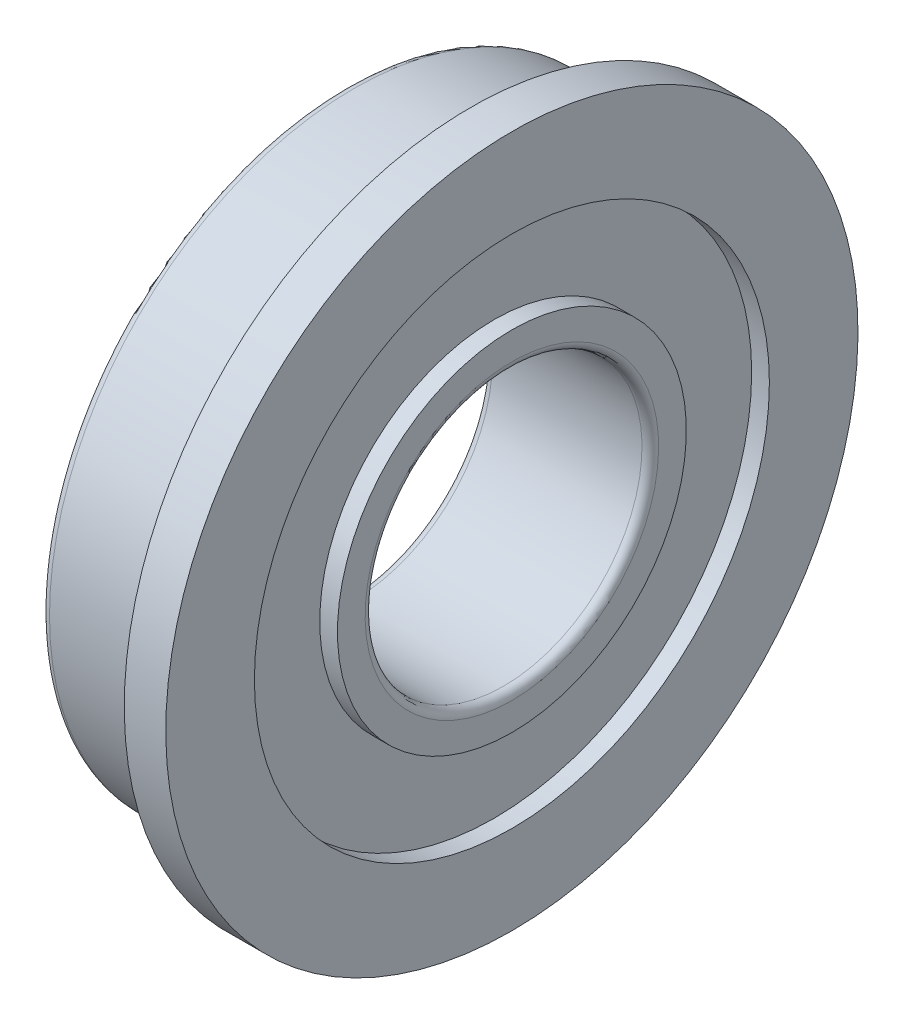
ISO-10303-21;
HEADER;
FILE_DESCRIPTION(('STEP AP214'),'2;1');
FILE_NAME('part.step','',(''),(''),'','','');
FILE_SCHEMA(('AUTOMOTIVE_DESIGN { 1 0 10303 214 1 1 1 1 }'));
ENDSEC;
DATA;
#1=APPLICATION_CONTEXT('core data for automotive mechanical design processes');
#2=APPLICATION_PROTOCOL_DEFINITION('international standard','automotive_design',2000,#1);
#3=PRODUCT_CONTEXT('',#1,'mechanical');
#4=PRODUCT('Part','Part','',(#3));
#5=PRODUCT_RELATED_PRODUCT_CATEGORY('part','',(#4));
#6=PRODUCT_DEFINITION_FORMATION('','',#4);
#7=PRODUCT_DEFINITION_CONTEXT('part definition',#1,'design');
#8=PRODUCT_DEFINITION('design','',#6,#7);
#9=PRODUCT_DEFINITION_SHAPE('','',#8);
#10=(LENGTH_UNIT() NAMED_UNIT(*) SI_UNIT(.MILLI.,.METRE.));
#11=(NAMED_UNIT(*) PLANE_ANGLE_UNIT() SI_UNIT($,.RADIAN.));
#12=(NAMED_UNIT(*) SI_UNIT($,.STERADIAN.) SOLID_ANGLE_UNIT());
#13=UNCERTAINTY_MEASURE_WITH_UNIT(LENGTH_MEASURE(1.E-05),#10,'distance_accuracy_value','');
#14=(GEOMETRIC_REPRESENTATION_CONTEXT(3) GLOBAL_UNCERTAINTY_ASSIGNED_CONTEXT((#13)) GLOBAL_UNIT_ASSIGNED_CONTEXT((#10,
#11,#12)) REPRESENTATION_CONTEXT('',''));
#15=CARTESIAN_POINT('',(0.,0.,0.));
#16=DIRECTION('',(0.,0.,1.));
#17=DIRECTION('',(1.,0.,0.));
#18=AXIS2_PLACEMENT_3D('',#15,#16,#17);
#19=CARTESIAN_POINT('',(-4.5,0.,0.));
#20=DIRECTION('',(-1.,0.,0.));
#21=DIRECTION('',(0.,-1.,0.));
#22=AXIS2_PLACEMENT_3D('',#19,#20,#21);
#23=CYLINDRICAL_SURFACE('',#22,12.5);
#24=CARTESIAN_POINT('',(0.,0.,0.));
#25=DIRECTION('',(-1.,0.,0.));
#26=DIRECTION('',(0.,-1.,0.));
#27=AXIS2_PLACEMENT_3D('',#24,#25,#26);
#28=CIRCLE('',#27,12.5);
#29=CARTESIAN_POINT('',(0.,-12.5,0.));
#30=VERTEX_POINT('',#29);
#31=EDGE_CURVE('E61',#30,#30,#28,.T.);
#32=ORIENTED_EDGE('',*,*,#31,.F.);
#33=EDGE_LOOP('',(#32));
#34=FACE_BOUND('',#33,.T.);
#35=CARTESIAN_POINT('',(1.5,0.,0.));
#36=DIRECTION('',(-1.,0.,0.));
#37=DIRECTION('',(0.,-1.,0.));
#38=AXIS2_PLACEMENT_3D('',#35,#36,#37);
#39=CIRCLE('',#38,12.5);
#40=CARTESIAN_POINT('',(1.5,-12.5,0.));
#41=VERTEX_POINT('',#40);
#42=EDGE_CURVE('E94',#41,#41,#39,.T.);
#43=ORIENTED_EDGE('',*,*,#42,.T.);
#44=EDGE_LOOP('',(#43));
#45=FACE_BOUND('',#44,.T.);
#46=ADVANCED_FACE('F35',(#34,#45),#23,.T.);
#47=CARTESIAN_POINT('',(0.,11.2,0.));
#48=DIRECTION('',(1.,0.,0.));
#49=DIRECTION('',(0.,1.,0.));
#50=AXIS2_PLACEMENT_3D('',#47,#48,#49);
#51=PLANE('',#50);
#52=CARTESIAN_POINT('',(0.,0.,0.));
#53=DIRECTION('',(-1.,0.,0.));
#54=DIRECTION('',(0.,-1.,0.));
#55=AXIS2_PLACEMENT_3D('',#52,#53,#54);
#56=CIRCLE('',#55,11.2);
#57=CARTESIAN_POINT('',(0.,-11.2,0.));
#58=VERTEX_POINT('',#57);
#59=EDGE_CURVE('E64',#58,#58,#56,.T.);
#60=ORIENTED_EDGE('',*,*,#59,.F.);
#61=EDGE_LOOP('',(#60));
#62=FACE_BOUND('',#61,.T.);
#63=ORIENTED_EDGE('',*,*,#31,.T.);
#64=EDGE_LOOP('',(#63));
#65=FACE_BOUND('',#64,.T.);
#66=ADVANCED_FACE('F137',(#62,#65),#51,.F.);
#67=CARTESIAN_POINT('',(0.,0.,0.));
#68=DIRECTION('',(-1.,0.,0.));
#69=DIRECTION('',(0.,-1.,0.));
#70=AXIS2_PLACEMENT_3D('',#67,#68,#69);
#71=TOROIDAL_SURFACE('',#70,11.,0.2);
#72=CARTESIAN_POINT('',(-0.200000000000001,0.,0.));
#73=DIRECTION('',(-1.,0.,0.));
#74=DIRECTION('',(0.,-1.,0.));
#75=AXIS2_PLACEMENT_3D('',#72,#73,#74);
#76=CIRCLE('',#75,11.);
#77=CARTESIAN_POINT('',(-0.200000000000001,-11.,0.));
#78=VERTEX_POINT('',#77);
#79=EDGE_CURVE('E67',#78,#78,#76,.T.);
#80=ORIENTED_EDGE('',*,*,#79,.F.);
#81=EDGE_LOOP('',(#80));
#82=FACE_BOUND('',#81,.T.);
#83=ORIENTED_EDGE('',*,*,#59,.T.);
#84=EDGE_LOOP('',(#83));
#85=FACE_BOUND('',#84,.T.);
#86=ADVANCED_FACE('F143',(#82,#85),#71,.F.);
#87=CARTESIAN_POINT('',(-4.5,0.,0.));
#88=DIRECTION('',(-1.,0.,0.));
#89=DIRECTION('',(0.,-1.,0.));
#90=AXIS2_PLACEMENT_3D('',#87,#88,#89);
#91=CYLINDRICAL_SURFACE('',#90,11.);
#92=CARTESIAN_POINT('',(-4.2,0.,0.));
#93=DIRECTION('',(1.,0.,0.));
#94=DIRECTION('',(0.,1.,0.));
#95=AXIS2_PLACEMENT_3D('',#92,#93,#94);
#96=CIRCLE('',#95,11.);
#97=CARTESIAN_POINT('',(-4.2,11.,0.));
#98=VERTEX_POINT('',#97);
#99=EDGE_CURVE('E10',#98,#98,#96,.T.);
#100=ORIENTED_EDGE('',*,*,#99,.T.);
#101=EDGE_LOOP('',(#100));
#102=FACE_BOUND('',#101,.T.);
#103=ORIENTED_EDGE('',*,*,#79,.T.);
#104=EDGE_LOOP('',(#103));
#105=FACE_BOUND('',#104,.T.);
#106=ADVANCED_FACE('F187',(#102,#105),#91,.T.);
#107=CARTESIAN_POINT('',(-4.5,9.3,0.));
#108=DIRECTION('',(1.,0.,0.));
#109=DIRECTION('',(0.,1.,0.));
#110=AXIS2_PLACEMENT_3D('',#107,#108,#109);
#111=PLANE('',#110);
#112=CARTESIAN_POINT('',(-4.5,0.,0.));
#113=DIRECTION('',(1.,0.,0.));
#114=DIRECTION('',(0.,1.,0.));
#115=AXIS2_PLACEMENT_3D('',#112,#113,#114);
#116=CIRCLE('',#115,10.7);
#117=CARTESIAN_POINT('',(-4.5,10.7,0.));
#118=VERTEX_POINT('',#117);
#119=EDGE_CURVE('E42',#118,#118,#116,.F.);
#120=ORIENTED_EDGE('',*,*,#119,.T.);
#121=EDGE_LOOP('',(#120));
#122=FACE_BOUND('',#121,.T.);
#123=CARTESIAN_POINT('',(-4.5,0.,0.));
#124=DIRECTION('',(-1.,0.,0.));
#125=DIRECTION('',(0.,-1.,0.));
#126=AXIS2_PLACEMENT_3D('',#123,#124,#125);
#127=CIRCLE('',#126,9.3);
#128=CARTESIAN_POINT('',(-4.5,-9.3,0.));
#129=VERTEX_POINT('',#128);
#130=EDGE_CURVE('E70',#129,#129,#127,.T.);
#131=ORIENTED_EDGE('',*,*,#130,.F.);
#132=EDGE_LOOP('',(#131));
#133=FACE_BOUND('',#132,.T.);
#134=ADVANCED_FACE('F182',(#122,#133),#111,.F.);
#135=CARTESIAN_POINT('',(-4.5,0.,0.));
#136=DIRECTION('',(-1.,0.,0.));
#137=DIRECTION('',(0.,-1.,0.));
#138=AXIS2_PLACEMENT_3D('',#135,#136,#137);
#139=CYLINDRICAL_SURFACE('',#138,9.3);
#140=CARTESIAN_POINT('',(-3.86,0.,0.));
#141=DIRECTION('',(-1.,0.,0.));
#142=DIRECTION('',(0.,-1.,0.));
#143=AXIS2_PLACEMENT_3D('',#140,#141,#142);
#144=CIRCLE('',#143,9.3);
#145=CARTESIAN_POINT('',(-3.86,-9.3,0.));
#146=VERTEX_POINT('',#145);
#147=EDGE_CURVE('E73',#146,#146,#144,.T.);
#148=ORIENTED_EDGE('',*,*,#147,.F.);
#149=EDGE_LOOP('',(#148));
#150=FACE_BOUND('',#149,.T.);
#151=ORIENTED_EDGE('',*,*,#130,.T.);
#152=EDGE_LOOP('',(#151));
#153=FACE_BOUND('',#152,.T.);
#154=ADVANCED_FACE('F176',(#150,#153),#139,.F.);
#155=CARTESIAN_POINT('',(-3.86,9.3,0.));
#156=DIRECTION('',(1.,0.,0.));
#157=DIRECTION('',(0.,1.,0.));
#158=AXIS2_PLACEMENT_3D('',#155,#156,#157);
#159=PLANE('',#158);
#160=CARTESIAN_POINT('',(-3.86,0.,0.));
#161=DIRECTION('',(-1.,0.,0.));
#162=DIRECTION('',(0.,-1.,0.));
#163=AXIS2_PLACEMENT_3D('',#160,#161,#162);
#164=CIRCLE('',#163,6.3);
#165=CARTESIAN_POINT('',(-3.86,-6.3,0.));
#166=VERTEX_POINT('',#165);
#167=EDGE_CURVE('E76',#166,#166,#164,.T.);
#168=ORIENTED_EDGE('',*,*,#167,.F.);
#169=EDGE_LOOP('',(#168));
#170=FACE_BOUND('',#169,.T.);
#171=ORIENTED_EDGE('',*,*,#147,.T.);
#172=EDGE_LOOP('',(#171));
#173=FACE_BOUND('',#172,.T.);
#174=ADVANCED_FACE('F170',(#170,#173),#159,.F.);
#175=CARTESIAN_POINT('',(-4.5,0.,0.));
#176=DIRECTION('',(-1.,0.,0.));
#177=DIRECTION('',(0.,-1.,0.));
#178=AXIS2_PLACEMENT_3D('',#175,#176,#177);
#179=CYLINDRICAL_SURFACE('',#178,6.3);
#180=CARTESIAN_POINT('',(-4.5,0.,0.));
#181=DIRECTION('',(-1.,0.,0.));
#182=DIRECTION('',(0.,-1.,0.));
#183=AXIS2_PLACEMENT_3D('',#180,#181,#182);
#184=CIRCLE('',#183,6.3);
#185=CARTESIAN_POINT('',(-4.5,-6.3,0.));
#186=VERTEX_POINT('',#185);
#187=EDGE_CURVE('E79',#186,#186,#184,.T.);
#188=ORIENTED_EDGE('',*,*,#187,.F.);
#189=EDGE_LOOP('',(#188));
#190=FACE_BOUND('',#189,.T.);
#191=ORIENTED_EDGE('',*,*,#167,.T.);
#192=EDGE_LOOP('',(#191));
#193=FACE_BOUND('',#192,.T.);
#194=ADVANCED_FACE('F164',(#190,#193),#179,.T.);
#195=CARTESIAN_POINT('',(-4.5,5.,0.));
#196=DIRECTION('',(1.,0.,0.));
#197=DIRECTION('',(0.,1.,0.));
#198=AXIS2_PLACEMENT_3D('',#195,#196,#197);
#199=PLANE('',#198);
#200=CARTESIAN_POINT('',(-4.5,0.,0.));
#201=DIRECTION('',(1.,0.,0.));
#202=DIRECTION('',(0.,1.,0.));
#203=AXIS2_PLACEMENT_3D('',#200,#201,#202);
#204=CIRCLE('',#203,5.3);
#205=CARTESIAN_POINT('',(-4.5,5.3,0.));
#206=VERTEX_POINT('',#205);
#207=EDGE_CURVE('E46',#206,#206,#204,.T.);
#208=ORIENTED_EDGE('',*,*,#207,.T.);
#209=EDGE_LOOP('',(#208));
#210=FACE_BOUND('',#209,.T.);
#211=ORIENTED_EDGE('',*,*,#187,.T.);
#212=EDGE_LOOP('',(#211));
#213=FACE_BOUND('',#212,.T.);
#214=ADVANCED_FACE('F133',(#210,#213),#199,.F.);
#215=CARTESIAN_POINT('',(-4.5,0.,0.));
#216=DIRECTION('',(-1.,0.,0.));
#217=DIRECTION('',(0.,-1.,0.));
#218=AXIS2_PLACEMENT_3D('',#215,#216,#217);
#219=CYLINDRICAL_SURFACE('',#218,5.);
#220=CARTESIAN_POINT('',(1.2,0.,0.));
#221=DIRECTION('',(-1.,0.,0.));
#222=DIRECTION('',(0.,-1.,0.));
#223=AXIS2_PLACEMENT_3D('',#220,#221,#222);
#224=CIRCLE('',#223,5.);
#225=CARTESIAN_POINT('',(1.2,-5.,0.));
#226=VERTEX_POINT('',#225);
#227=EDGE_CURVE('E50',#226,#226,#224,.F.);
#228=ORIENTED_EDGE('',*,*,#227,.T.);
#229=EDGE_LOOP('',(#228));
#230=FACE_BOUND('',#229,.T.);
#231=CARTESIAN_POINT('',(-4.2,0.,0.));
#232=DIRECTION('',(1.,0.,0.));
#233=DIRECTION('',(0.,1.,0.));
#234=AXIS2_PLACEMENT_3D('',#231,#232,#233);
#235=CIRCLE('',#234,5.);
#236=CARTESIAN_POINT('',(-4.2,5.,0.));
#237=VERTEX_POINT('',#236);
#238=EDGE_CURVE('E55',#237,#237,#235,.F.);
#239=ORIENTED_EDGE('',*,*,#238,.T.);
#240=EDGE_LOOP('',(#239));
#241=FACE_BOUND('',#240,.T.);
#242=ADVANCED_FACE('F126',(#230,#241),#219,.F.);
#243=CARTESIAN_POINT('',(1.5,6.3,0.));
#244=DIRECTION('',(-1.,0.,0.));
#245=DIRECTION('',(0.,-1.,0.));
#246=AXIS2_PLACEMENT_3D('',#243,#244,#245);
#247=PLANE('',#246);
#248=CARTESIAN_POINT('',(1.5,0.,0.));
#249=DIRECTION('',(-1.,0.,0.));
#250=DIRECTION('',(0.,-1.,0.));
#251=AXIS2_PLACEMENT_3D('',#248,#249,#250);
#252=CIRCLE('',#251,5.3);
#253=CARTESIAN_POINT('',(1.5,-5.3,0.));
#254=VERTEX_POINT('',#253);
#255=EDGE_CURVE('E58',#254,#254,#252,.T.);
#256=ORIENTED_EDGE('',*,*,#255,.T.);
#257=EDGE_LOOP('',(#256));
#258=FACE_BOUND('',#257,.T.);
#259=CARTESIAN_POINT('',(1.5,0.,0.));
#260=DIRECTION('',(-1.,0.,0.));
#261=DIRECTION('',(0.,-1.,0.));
#262=AXIS2_PLACEMENT_3D('',#259,#260,#261);
#263=CIRCLE('',#262,6.3);
#264=CARTESIAN_POINT('',(1.5,-6.3,0.));
#265=VERTEX_POINT('',#264);
#266=EDGE_CURVE('E82',#265,#265,#263,.T.);
#267=ORIENTED_EDGE('',*,*,#266,.F.);
#268=EDGE_LOOP('',(#267));
#269=FACE_BOUND('',#268,.T.);
#270=ADVANCED_FACE('F121',(#258,#269),#247,.F.);
#271=CARTESIAN_POINT('',(-4.5,0.,0.));
#272=DIRECTION('',(-1.,0.,0.));
#273=DIRECTION('',(0.,-1.,0.));
#274=AXIS2_PLACEMENT_3D('',#271,#272,#273);
#275=CYLINDRICAL_SURFACE('',#274,6.3);
#276=CARTESIAN_POINT('',(0.859999999999998,0.,0.));
#277=DIRECTION('',(-1.,0.,0.));
#278=DIRECTION('',(0.,-1.,0.));
#279=AXIS2_PLACEMENT_3D('',#276,#277,#278);
#280=CIRCLE('',#279,6.3);
#281=CARTESIAN_POINT('',(0.859999999999998,-6.3,0.));
#282=VERTEX_POINT('',#281);
#283=EDGE_CURVE('E85',#282,#282,#280,.T.);
#284=ORIENTED_EDGE('',*,*,#283,.F.);
#285=EDGE_LOOP('',(#284));
#286=FACE_BOUND('',#285,.T.);
#287=ORIENTED_EDGE('',*,*,#266,.T.);
#288=EDGE_LOOP('',(#287));
#289=FACE_BOUND('',#288,.T.);
#290=ADVANCED_FACE('F115',(#286,#289),#275,.T.);
#291=CARTESIAN_POINT('',(0.859999999999998,9.3,0.));
#292=DIRECTION('',(-1.,0.,0.));
#293=DIRECTION('',(0.,-1.,0.));
#294=AXIS2_PLACEMENT_3D('',#291,#292,#293);
#295=PLANE('',#294);
#296=CARTESIAN_POINT('',(0.859999999999998,0.,0.));
#297=DIRECTION('',(-1.,0.,0.));
#298=DIRECTION('',(0.,-1.,0.));
#299=AXIS2_PLACEMENT_3D('',#296,#297,#298);
#300=CIRCLE('',#299,9.3);
#301=CARTESIAN_POINT('',(0.859999999999998,-9.3,0.));
#302=VERTEX_POINT('',#301);
#303=EDGE_CURVE('E88',#302,#302,#300,.T.);
#304=ORIENTED_EDGE('',*,*,#303,.F.);
#305=EDGE_LOOP('',(#304));
#306=FACE_BOUND('',#305,.T.);
#307=ORIENTED_EDGE('',*,*,#283,.T.);
#308=EDGE_LOOP('',(#307));
#309=FACE_BOUND('',#308,.T.);
#310=ADVANCED_FACE('F109',(#306,#309),#295,.F.);
#311=CARTESIAN_POINT('',(-4.5,0.,0.));
#312=DIRECTION('',(-1.,0.,0.));
#313=DIRECTION('',(0.,-1.,0.));
#314=AXIS2_PLACEMENT_3D('',#311,#312,#313);
#315=CYLINDRICAL_SURFACE('',#314,9.3);
#316=CARTESIAN_POINT('',(1.5,0.,0.));
#317=DIRECTION('',(-1.,0.,0.));
#318=DIRECTION('',(0.,-1.,0.));
#319=AXIS2_PLACEMENT_3D('',#316,#317,#318);
#320=CIRCLE('',#319,9.3);
#321=CARTESIAN_POINT('',(1.5,-9.3,0.));
#322=VERTEX_POINT('',#321);
#323=EDGE_CURVE('E91',#322,#322,#320,.T.);
#324=ORIENTED_EDGE('',*,*,#323,.F.);
#325=EDGE_LOOP('',(#324));
#326=FACE_BOUND('',#325,.T.);
#327=ORIENTED_EDGE('',*,*,#303,.T.);
#328=EDGE_LOOP('',(#327));
#329=FACE_BOUND('',#328,.T.);
#330=ADVANCED_FACE('F103',(#326,#329),#315,.F.);
#331=CARTESIAN_POINT('',(1.5,12.5,0.));
#332=DIRECTION('',(-1.,0.,0.));
#333=DIRECTION('',(0.,-1.,0.));
#334=AXIS2_PLACEMENT_3D('',#331,#332,#333);
#335=PLANE('',#334);
#336=ORIENTED_EDGE('',*,*,#42,.F.);
#337=EDGE_LOOP('',(#336));
#338=FACE_BOUND('',#337,.T.);
#339=ORIENTED_EDGE('',*,*,#323,.T.);
#340=EDGE_LOOP('',(#339));
#341=FACE_BOUND('',#340,.T.);
#342=ADVANCED_FACE('F99',(#338,#341),#335,.F.);
#343=CARTESIAN_POINT('',(1.2,0.,0.));
#344=DIRECTION('',(-1.,0.,0.));
#345=DIRECTION('',(0.,-1.,0.));
#346=AXIS2_PLACEMENT_3D('',#343,#344,#345);
#347=TOROIDAL_SURFACE('',#346,5.3,0.3);
#348=ORIENTED_EDGE('',*,*,#227,.F.);
#349=EDGE_LOOP('',(#348));
#350=FACE_BOUND('',#349,.T.);
#351=ORIENTED_EDGE('',*,*,#255,.F.);
#352=EDGE_LOOP('',(#351));
#353=FACE_BOUND('',#352,.T.);
#354=ADVANCED_FACE('F102',(#350,#353),#347,.T.);
#355=CARTESIAN_POINT('',(-4.2,0.,0.));
#356=DIRECTION('',(1.,0.,0.));
#357=DIRECTION('',(0.,1.,0.));
#358=AXIS2_PLACEMENT_3D('',#355,#356,#357);
#359=TOROIDAL_SURFACE('',#358,5.3,0.3);
#360=ORIENTED_EDGE('',*,*,#207,.F.);
#361=EDGE_LOOP('',(#360));
#362=FACE_BOUND('',#361,.T.);
#363=ORIENTED_EDGE('',*,*,#238,.F.);
#364=EDGE_LOOP('',(#363));
#365=FACE_BOUND('',#364,.T.);
#366=ADVANCED_FACE('F149',(#362,#365),#359,.T.);
#367=CARTESIAN_POINT('',(-4.2,0.,0.));
#368=DIRECTION('',(1.,0.,0.));
#369=DIRECTION('',(0.,1.,0.));
#370=AXIS2_PLACEMENT_3D('',#367,#368,#369);
#371=TOROIDAL_SURFACE('',#370,10.7,0.3);
#372=ORIENTED_EDGE('',*,*,#99,.F.);
#373=EDGE_LOOP('',(#372));
#374=FACE_BOUND('',#373,.T.);
#375=ORIENTED_EDGE('',*,*,#119,.F.);
#376=EDGE_LOOP('',(#375));
#377=FACE_BOUND('',#376,.T.);
#378=ADVANCED_FACE('F37',(#374,#377),#371,.T.);
#379=CLOSED_SHELL('',(#46,#66,#86,#106,#134,#154,#174,#194,#214,#242,#270,#290,#310,#330,#342,
#354,#366,#378));
#380=MANIFOLD_SOLID_BREP('B2',#379);
#381=ADVANCED_BREP_SHAPE_REPRESENTATION('',(#18,#380),#14);
#382=SHAPE_DEFINITION_REPRESENTATION(#9,#381);
ENDSEC;
END-ISO-10303-21;
